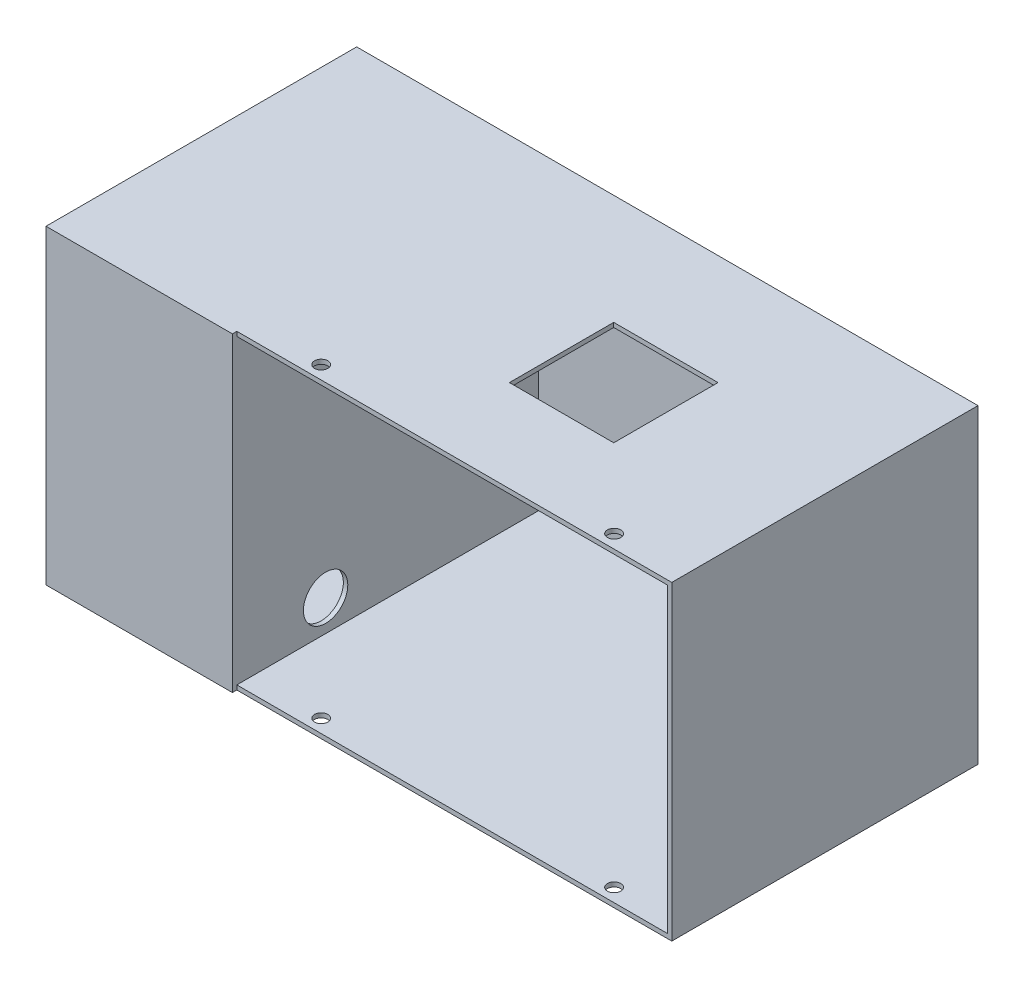
ISO-10303-21;
HEADER;
FILE_DESCRIPTION(('STEP AP214'),'2;1');
FILE_NAME('part.step','',(''),(''),'','','');
FILE_SCHEMA(('AUTOMOTIVE_DESIGN { 1 0 10303 214 1 1 1 1 }'));
ENDSEC;
DATA;
#1=APPLICATION_CONTEXT('core data for automotive mechanical design processes');
#2=APPLICATION_PROTOCOL_DEFINITION('international standard','automotive_design',2000,#1);
#3=PRODUCT_CONTEXT('',#1,'mechanical');
#4=PRODUCT('Part','Part','',(#3));
#5=PRODUCT_RELATED_PRODUCT_CATEGORY('part','',(#4));
#6=PRODUCT_DEFINITION_FORMATION('','',#4);
#7=PRODUCT_DEFINITION_CONTEXT('part definition',#1,'design');
#8=PRODUCT_DEFINITION('design','',#6,#7);
#9=PRODUCT_DEFINITION_SHAPE('','',#8);
#10=(LENGTH_UNIT() NAMED_UNIT(*) SI_UNIT(.MILLI.,.METRE.));
#11=(NAMED_UNIT(*) PLANE_ANGLE_UNIT() SI_UNIT($,.RADIAN.));
#12=(NAMED_UNIT(*) SI_UNIT($,.STERADIAN.) SOLID_ANGLE_UNIT());
#13=UNCERTAINTY_MEASURE_WITH_UNIT(LENGTH_MEASURE(1.E-05),#10,'distance_accuracy_value','');
#14=(GEOMETRIC_REPRESENTATION_CONTEXT(3) GLOBAL_UNCERTAINTY_ASSIGNED_CONTEXT((#13)) GLOBAL_UNIT_ASSIGNED_CONTEXT((#10,
#11,#12)) REPRESENTATION_CONTEXT('',''));
#15=CARTESIAN_POINT('',(0.,0.,0.));
#16=DIRECTION('',(0.,0.,1.));
#17=DIRECTION('',(1.,0.,0.));
#18=AXIS2_PLACEMENT_3D('',#15,#16,#17);
#19=CARTESIAN_POINT('',(0.,-29.6073277578654,70.));
#20=DIRECTION('',(0.,1.,0.));
#21=DIRECTION('',(0.,0.,1.));
#22=AXIS2_PLACEMENT_3D('',#19,#20,#21);
#23=PLANE('',#22);
#24=CARTESIAN_POINT('',(3.47062923138192,-29.6073277578654,66.));
#25=DIRECTION('',(0.,1.,0.));
#26=DIRECTION('',(0.,0.,1.));
#27=AXIS2_PLACEMENT_3D('',#24,#25,#26);
#28=CIRCLE('',#27,1.5);
#29=CARTESIAN_POINT('',(3.47062923138192,-29.6073277578654,67.5));
#30=VERTEX_POINT('',#29);
#31=EDGE_CURVE('E312',#30,#30,#28,.T.);
#32=ORIENTED_EDGE('',*,*,#31,.F.);
#33=EDGE_LOOP('',(#32));
#34=FACE_BOUND('',#33,.T.);
#35=CARTESIAN_POINT('',(69.4706292313819,-29.6073277578654,66.));
#36=DIRECTION('',(0.,1.,0.));
#37=DIRECTION('',(0.,0.,1.));
#38=AXIS2_PLACEMENT_3D('',#35,#36,#37);
#39=CIRCLE('',#38,1.5);
#40=CARTESIAN_POINT('',(69.4706292313819,-29.6073277578654,67.5));
#41=VERTEX_POINT('',#40);
#42=EDGE_CURVE('E302',#41,#41,#39,.T.);
#43=ORIENTED_EDGE('',*,*,#42,.F.);
#44=EDGE_LOOP('',(#43));
#45=FACE_BOUND('',#44,.T.);
#46=DIRECTION('',(0.,0.,-1.));
#47=VECTOR('',#46,1.);
#48=CARTESIAN_POINT('',(-12.5293707686181,-29.6073277578654,69.));
#49=LINE('',#48,#47);
#50=CARTESIAN_POINT('',(-12.5293707686181,-29.6073277578654,69.));
#51=VERTEX_POINT('',#50);
#52=CARTESIAN_POINT('',(-12.5293707686181,-29.6073277578654,1.));
#53=VERTEX_POINT('',#52);
#54=EDGE_CURVE('E393',#51,#53,#49,.T.);
#55=ORIENTED_EDGE('',*,*,#54,.F.);
#56=DIRECTION('',(1.,0.,0.));
#57=VECTOR('',#56,1.);
#58=CARTESIAN_POINT('',(0.,-29.6073277578654,69.));
#59=LINE('',#58,#57);
#60=CARTESIAN_POINT('',(84.4706292313819,-29.6073277578654,69.));
#61=VERTEX_POINT('',#60);
#62=EDGE_CURVE('E292',#51,#61,#59,.T.);
#63=ORIENTED_EDGE('',*,*,#62,.T.);
#64=DIRECTION('',(0.,0.,-1.));
#65=VECTOR('',#64,1.);
#66=CARTESIAN_POINT('',(84.4706292313819,-29.6073277578654,70.));
#67=LINE('',#66,#65);
#68=CARTESIAN_POINT('',(84.4706292313819,-29.6073277578654,1.));
#69=VERTEX_POINT('',#68);
#70=EDGE_CURVE('E410',#61,#69,#67,.T.);
#71=ORIENTED_EDGE('',*,*,#70,.T.);
#72=DIRECTION('',(1.,0.,0.));
#73=VECTOR('',#72,1.);
#74=CARTESIAN_POINT('',(0.,-29.6073277578654,1.));
#75=LINE('',#74,#73);
#76=EDGE_CURVE('E404',#53,#69,#75,.T.);
#77=ORIENTED_EDGE('',*,*,#76,.F.);
#78=EDGE_LOOP('',(#55,#63,#71,#77));
#79=FACE_BOUND('',#78,.T.);
#80=ADVANCED_FACE('F67',(#34,#45,#79),#23,.T.);
#81=CARTESIAN_POINT('',(0.,38.3926722421346,70.));
#82=DIRECTION('',(0.,1.,0.));
#83=DIRECTION('',(0.,0.,1.));
#84=AXIS2_PLACEMENT_3D('',#81,#82,#83);
#85=PLANE('',#84);
#86=DIRECTION('',(1.,0.,0.));
#87=VECTOR('',#86,1.);
#88=CARTESIAN_POINT('',(0.,38.3926722421346,24.7949933549175));
#89=LINE('',#88,#87);
#90=CARTESIAN_POINT('',(28.1884264574142,38.3926722421346,24.7949933549175));
#91=VERTEX_POINT('',#90);
#92=CARTESIAN_POINT('',(51.6884264574142,38.3926722421346,24.7949933549175));
#93=VERTEX_POINT('',#92);
#94=EDGE_CURVE('E261',#91,#93,#89,.T.);
#95=ORIENTED_EDGE('',*,*,#94,.F.);
#96=DIRECTION('',(0.,0.,1.));
#97=VECTOR('',#96,1.);
#98=CARTESIAN_POINT('',(28.1884264574142,38.3926722421346,70.));
#99=LINE('',#98,#97);
#100=CARTESIAN_POINT('',(28.1884264574142,38.3926722421346,48.2949933549175));
#101=VERTEX_POINT('',#100);
#102=EDGE_CURVE('E263',#91,#101,#99,.T.);
#103=ORIENTED_EDGE('',*,*,#102,.T.);
#104=DIRECTION('',(1.,0.,0.));
#105=VECTOR('',#104,1.);
#106=CARTESIAN_POINT('',(0.,38.3926722421346,48.2949933549175));
#107=LINE('',#106,#105);
#108=CARTESIAN_POINT('',(51.6884264574142,38.3926722421346,48.2949933549175));
#109=VERTEX_POINT('',#108);
#110=EDGE_CURVE('E256',#101,#109,#107,.T.);
#111=ORIENTED_EDGE('',*,*,#110,.T.);
#112=DIRECTION('',(0.,0.,1.));
#113=VECTOR('',#112,1.);
#114=CARTESIAN_POINT('',(51.6884264574142,38.3926722421346,70.));
#115=LINE('',#114,#113);
#116=EDGE_CURVE('E236',#93,#109,#115,.T.);
#117=ORIENTED_EDGE('',*,*,#116,.F.);
#118=EDGE_LOOP('',(#95,#103,#111,#117));
#119=FACE_BOUND('',#118,.T.);
#120=CARTESIAN_POINT('',(69.4706292313819,38.3926722421346,66.));
#121=DIRECTION('',(0.,1.,0.));
#122=DIRECTION('',(0.,0.,1.));
#123=AXIS2_PLACEMENT_3D('',#120,#121,#122);
#124=CIRCLE('',#123,1.5);
#125=CARTESIAN_POINT('',(69.4706292313819,38.3926722421346,67.5));
#126=VERTEX_POINT('',#125);
#127=EDGE_CURVE('E299',#126,#126,#124,.T.);
#128=ORIENTED_EDGE('',*,*,#127,.T.);
#129=EDGE_LOOP('',(#128));
#130=FACE_BOUND('',#129,.T.);
#131=CARTESIAN_POINT('',(3.47062923138192,38.3926722421346,66.));
#132=DIRECTION('',(0.,1.,0.));
#133=DIRECTION('',(0.,0.,1.));
#134=AXIS2_PLACEMENT_3D('',#131,#132,#133);
#135=CIRCLE('',#134,1.5);
#136=CARTESIAN_POINT('',(3.47062923138192,38.3926722421346,67.5));
#137=VERTEX_POINT('',#136);
#138=EDGE_CURVE('E309',#137,#137,#135,.T.);
#139=ORIENTED_EDGE('',*,*,#138,.T.);
#140=EDGE_LOOP('',(#139));
#141=FACE_BOUND('',#140,.T.);
#142=DIRECTION('',(1.,0.,0.));
#143=VECTOR('',#142,1.);
#144=CARTESIAN_POINT('',(0.,38.3926722421346,69.));
#145=LINE('',#144,#143);
#146=CARTESIAN_POINT('',(-12.5293707686181,38.3926722421346,69.));
#147=VERTEX_POINT('',#146);
#148=CARTESIAN_POINT('',(84.4706292313819,38.3926722421346,69.));
#149=VERTEX_POINT('',#148);
#150=EDGE_CURVE('E290',#147,#149,#145,.T.);
#151=ORIENTED_EDGE('',*,*,#150,.F.);
#152=DIRECTION('',(0.,0.,-1.));
#153=VECTOR('',#152,1.);
#154=CARTESIAN_POINT('',(-12.5293707686181,38.3926722421346,69.));
#155=LINE('',#154,#153);
#156=CARTESIAN_POINT('',(-12.5293707686181,38.3926722421346,1.));
#157=VERTEX_POINT('',#156);
#158=EDGE_CURVE('E391',#147,#157,#155,.T.);
#159=ORIENTED_EDGE('',*,*,#158,.T.);
#160=DIRECTION('',(1.,0.,0.));
#161=VECTOR('',#160,1.);
#162=CARTESIAN_POINT('',(0.,38.3926722421346,1.));
#163=LINE('',#162,#161);
#164=CARTESIAN_POINT('',(84.4706292313819,38.3926722421346,1.));
#165=VERTEX_POINT('',#164);
#166=EDGE_CURVE('E398',#157,#165,#163,.T.);
#167=ORIENTED_EDGE('',*,*,#166,.T.);
#168=DIRECTION('',(0.,0.,-1.));
#169=VECTOR('',#168,1.);
#170=CARTESIAN_POINT('',(84.4706292313819,38.3926722421346,70.));
#171=LINE('',#170,#169);
#172=EDGE_CURVE('E408',#149,#165,#171,.T.);
#173=ORIENTED_EDGE('',*,*,#172,.F.);
#174=EDGE_LOOP('',(#151,#159,#167,#173));
#175=FACE_BOUND('',#174,.T.);
#176=ADVANCED_FACE('F466',(#119,#130,#141,#175),#85,.F.);
#177=CARTESIAN_POINT('',(85.4706292313819,39.3926722421346,70.));
#178=DIRECTION('',(1.,0.,0.));
#179=DIRECTION('',(0.,0.,-1.));
#180=AXIS2_PLACEMENT_3D('',#177,#178,#179);
#181=PLANE('',#180);
#182=DIRECTION('',(0.,0.,-1.));
#183=VECTOR('',#182,1.);
#184=CARTESIAN_POINT('',(85.4706292313819,39.3926722421346,70.));
#185=LINE('',#184,#183);
#186=CARTESIAN_POINT('',(85.4706292313819,39.3926722421346,69.));
#187=VERTEX_POINT('',#186);
#188=CARTESIAN_POINT('',(85.4706292313819,39.3926722421346,0.));
#189=VERTEX_POINT('',#188);
#190=EDGE_CURVE('E436',#187,#189,#185,.T.);
#191=ORIENTED_EDGE('',*,*,#190,.F.);
#192=DIRECTION('',(0.,1.,0.));
#193=VECTOR('',#192,1.);
#194=CARTESIAN_POINT('',(85.4706292313819,39.3926722421346,69.));
#195=LINE('',#194,#193);
#196=CARTESIAN_POINT('',(85.4706292313819,-30.6073277578654,69.));
#197=VERTEX_POINT('',#196);
#198=EDGE_CURVE('E277',#197,#187,#195,.T.);
#199=ORIENTED_EDGE('',*,*,#198,.F.);
#200=DIRECTION('',(0.,0.,-1.));
#201=VECTOR('',#200,1.);
#202=CARTESIAN_POINT('',(85.4706292313819,-30.6073277578654,70.));
#203=LINE('',#202,#201);
#204=CARTESIAN_POINT('',(85.4706292313819,-30.6073277578654,0.));
#205=VERTEX_POINT('',#204);
#206=EDGE_CURVE('E438',#197,#205,#203,.T.);
#207=ORIENTED_EDGE('',*,*,#206,.T.);
#208=DIRECTION('',(0.,-1.,0.));
#209=VECTOR('',#208,1.);
#210=CARTESIAN_POINT('',(85.4706292313819,39.3926722421346,0.));
#211=LINE('',#210,#209);
#212=EDGE_CURVE('E425',#189,#205,#211,.T.);
#213=ORIENTED_EDGE('',*,*,#212,.F.);
#214=EDGE_LOOP('',(#191,#199,#207,#213));
#215=FACE_BOUND('',#214,.T.);
#216=ADVANCED_FACE('F469',(#215),#181,.T.);
#217=CARTESIAN_POINT('',(84.4706292313819,0.,70.));
#218=DIRECTION('',(1.,0.,0.));
#219=DIRECTION('',(0.,0.,-1.));
#220=AXIS2_PLACEMENT_3D('',#217,#218,#219);
#221=PLANE('',#220);
#222=DIRECTION('',(0.,-1.,0.));
#223=VECTOR('',#222,1.);
#224=CARTESIAN_POINT('',(84.4706292313819,0.,69.));
#225=LINE('',#224,#223);
#226=EDGE_CURVE('E286',#149,#61,#225,.T.);
#227=ORIENTED_EDGE('',*,*,#226,.F.);
#228=ORIENTED_EDGE('',*,*,#172,.T.);
#229=DIRECTION('',(0.,-1.,0.));
#230=VECTOR('',#229,1.);
#231=CARTESIAN_POINT('',(84.4706292313819,0.,1.));
#232=LINE('',#231,#230);
#233=EDGE_CURVE('E401',#165,#69,#232,.T.);
#234=ORIENTED_EDGE('',*,*,#233,.T.);
#235=ORIENTED_EDGE('',*,*,#70,.F.);
#236=EDGE_LOOP('',(#227,#228,#234,#235));
#237=FACE_BOUND('',#236,.T.);
#238=ADVANCED_FACE('F494',(#237),#221,.F.);
#239=CARTESIAN_POINT('',(0.,0.,1.));
#240=DIRECTION('',(0.,0.,1.));
#241=DIRECTION('',(1.,0.,0.));
#242=AXIS2_PLACEMENT_3D('',#239,#240,#241);
#243=PLANE('',#242);
#244=DIRECTION('',(0.,-1.,0.));
#245=VECTOR('',#244,1.);
#246=CARTESIAN_POINT('',(-13.5293707686181,38.3926722421346,1.));
#247=LINE('',#246,#245);
#248=CARTESIAN_POINT('',(-13.5293707686181,-14.6073277578654,1.));
#249=VERTEX_POINT('',#248);
#250=CARTESIAN_POINT('',(-13.5293707686181,-29.6073277578654,1.));
#251=VERTEX_POINT('',#250);
#252=EDGE_CURVE('E377',#249,#251,#247,.T.);
#253=ORIENTED_EDGE('',*,*,#252,.F.);
#254=DIRECTION('',(1.,0.,0.));
#255=VECTOR('',#254,1.);
#256=CARTESIAN_POINT('',(-55.0293707686181,-14.6073277578654,0.999999999999999));
#257=LINE('',#256,#255);
#258=CARTESIAN_POINT('',(-54.5293707686181,-14.6073277578654,1.00000000000001));
#259=VERTEX_POINT('',#258);
#260=EDGE_CURVE('E340',#259,#249,#257,.T.);
#261=ORIENTED_EDGE('',*,*,#260,.F.);
#262=DIRECTION('',(0.,-1.,0.));
#263=VECTOR('',#262,1.);
#264=CARTESIAN_POINT('',(-54.5293707686181,38.3926722421346,1.));
#265=LINE('',#264,#263);
#266=CARTESIAN_POINT('',(-54.5293707686181,-29.6073277578654,1.00000000000001));
#267=VERTEX_POINT('',#266);
#268=EDGE_CURVE('E358',#259,#267,#265,.T.);
#269=ORIENTED_EDGE('',*,*,#268,.T.);
#270=EDGE_CURVE('E405',#267,#251,#75,.T.);
#271=ORIENTED_EDGE('',*,*,#270,.T.);
#272=EDGE_LOOP('',(#253,#261,#269,#271));
#273=FACE_BOUND('',#272,.T.);
#274=ADVANCED_FACE('F533',(#273),#243,.T.);
#275=CARTESIAN_POINT('',(-54.5293707686181,38.3926722421346,1.));
#276=VERTEX_POINT('',#275);
#277=CARTESIAN_POINT('',(-54.5293707686181,-13.6073277578654,1.00000000000001));
#278=VERTEX_POINT('',#277);
#279=EDGE_CURVE('E359',#276,#278,#265,.T.);
#280=ORIENTED_EDGE('',*,*,#279,.T.);
#281=DIRECTION('',(1.,0.,0.));
#282=VECTOR('',#281,1.);
#283=CARTESIAN_POINT('',(-55.0293707686181,-13.6073277578654,0.999999999999999));
#284=LINE('',#283,#282);
#285=CARTESIAN_POINT('',(-13.5293707686181,-13.6073277578654,1.));
#286=VERTEX_POINT('',#285);
#287=EDGE_CURVE('E326',#278,#286,#284,.T.);
#288=ORIENTED_EDGE('',*,*,#287,.T.);
#289=CARTESIAN_POINT('',(-13.5293707686181,38.3926722421346,1.));
#290=VERTEX_POINT('',#289);
#291=EDGE_CURVE('E383',#290,#286,#247,.T.);
#292=ORIENTED_EDGE('',*,*,#291,.F.);
#293=EDGE_CURVE('E399',#276,#290,#163,.T.);
#294=ORIENTED_EDGE('',*,*,#293,.F.);
#295=EDGE_LOOP('',(#280,#288,#292,#294));
#296=FACE_BOUND('',#295,.T.);
#297=ADVANCED_FACE('F557',(#296),#243,.T.);
#298=CARTESIAN_POINT('',(-13.5293707686181,38.3926722421346,69.));
#299=DIRECTION('',(1.,0.,0.));
#300=DIRECTION('',(0.,1.,0.));
#301=AXIS2_PLACEMENT_3D('',#298,#299,#300);
#302=PLANE('',#301);
#303=CARTESIAN_POINT('',(-13.5293707686181,-22.6073277578654,49.));
#304=DIRECTION('',(-1.,0.,0.));
#305=DIRECTION('',(0.,-1.,0.));
#306=AXIS2_PLACEMENT_3D('',#303,#304,#305);
#307=CIRCLE('',#306,5.);
#308=CARTESIAN_POINT('',(-13.5293707686181,-27.6073277578654,49.));
#309=VERTEX_POINT('',#308);
#310=EDGE_CURVE('E613',#309,#309,#307,.T.);
#311=ORIENTED_EDGE('',*,*,#310,.F.);
#312=EDGE_LOOP('',(#311));
#313=FACE_BOUND('',#312,.T.);
#314=DIRECTION('',(0.,0.,1.));
#315=VECTOR('',#314,1.);
#316=CARTESIAN_POINT('',(-13.5293707686181,-14.6073277578654,0.999999999999999));
#317=LINE('',#316,#315);
#318=CARTESIAN_POINT('',(-13.5293707686181,-14.6073277578654,69.));
#319=VERTEX_POINT('',#318);
#320=EDGE_CURVE('E315',#249,#319,#317,.T.);
#321=ORIENTED_EDGE('',*,*,#320,.F.);
#322=ORIENTED_EDGE('',*,*,#252,.T.);
#323=DIRECTION('',(0.,0.,-1.));
#324=VECTOR('',#323,1.);
#325=CARTESIAN_POINT('',(-13.5293707686181,-29.6073277578654,69.));
#326=LINE('',#325,#324);
#327=CARTESIAN_POINT('',(-13.5293707686181,-29.6073277578654,69.));
#328=VERTEX_POINT('',#327);
#329=EDGE_CURVE('E395',#328,#251,#326,.T.);
#330=ORIENTED_EDGE('',*,*,#329,.F.);
#331=DIRECTION('',(0.,-1.,0.));
#332=VECTOR('',#331,1.);
#333=CARTESIAN_POINT('',(-13.5293707686181,38.3926722421346,69.));
#334=LINE('',#333,#332);
#335=EDGE_CURVE('E382',#319,#328,#334,.T.);
#336=ORIENTED_EDGE('',*,*,#335,.F.);
#337=EDGE_LOOP('',(#321,#322,#330,#336));
#338=FACE_BOUND('',#337,.T.);
#339=ADVANCED_FACE('F529',(#313,#338),#302,.F.);
#340=CARTESIAN_POINT('',(-13.5293707686181,14.3926722421346,35.));
#341=DIRECTION('',(1.,0.,0.));
#342=DIRECTION('',(0.,1.,0.));
#343=AXIS2_PLACEMENT_3D('',#340,#341,#342);
#344=CIRCLE('',#343,5.);
#345=CARTESIAN_POINT('',(-13.5293707686181,19.3926722421346,35.));
#346=VERTEX_POINT('',#345);
#347=EDGE_CURVE('E440',#346,#346,#344,.F.);
#348=ORIENTED_EDGE('',*,*,#347,.F.);
#349=EDGE_LOOP('',(#348));
#350=FACE_BOUND('',#349,.T.);
#351=DIRECTION('',(0.,0.,-1.));
#352=VECTOR('',#351,1.);
#353=CARTESIAN_POINT('',(-13.5293707686181,-13.6073277578654,0.999999999999999));
#354=LINE('',#353,#352);
#355=CARTESIAN_POINT('',(-13.5293707686181,-13.6073277578654,69.));
#356=VERTEX_POINT('',#355);
#357=EDGE_CURVE('E320',#356,#286,#354,.T.);
#358=ORIENTED_EDGE('',*,*,#357,.F.);
#359=CARTESIAN_POINT('',(-13.5293707686181,38.3926722421346,69.));
#360=VERTEX_POINT('',#359);
#361=EDGE_CURVE('E379',#360,#356,#334,.T.);
#362=ORIENTED_EDGE('',*,*,#361,.F.);
#363=DIRECTION('',(0.,0.,-1.));
#364=VECTOR('',#363,1.);
#365=CARTESIAN_POINT('',(-13.5293707686181,38.3926722421346,69.));
#366=LINE('',#365,#364);
#367=EDGE_CURVE('E381',#360,#290,#366,.T.);
#368=ORIENTED_EDGE('',*,*,#367,.T.);
#369=ORIENTED_EDGE('',*,*,#291,.T.);
#370=EDGE_LOOP('',(#358,#362,#368,#369));
#371=FACE_BOUND('',#370,.T.);
#372=ADVANCED_FACE('F564',(#350,#371),#302,.F.);
#373=CARTESIAN_POINT('',(-29.5293707686181,38.3926722421346,69.));
#374=DIRECTION('',(0.,0.,1.));
#375=DIRECTION('',(0.,-1.,0.));
#376=AXIS2_PLACEMENT_3D('',#373,#374,#375);
#377=PLANE('',#376);
#378=DIRECTION('',(-1.,0.,0.));
#379=VECTOR('',#378,1.);
#380=CARTESIAN_POINT('',(-29.5293707686181,-14.6073277578654,69.));
#381=LINE('',#380,#379);
#382=CARTESIAN_POINT('',(-54.5293707686181,-14.6073277578654,69.));
#383=VERTEX_POINT('',#382);
#384=EDGE_CURVE('E12',#319,#383,#381,.T.);
#385=ORIENTED_EDGE('',*,*,#384,.F.);
#386=ORIENTED_EDGE('',*,*,#335,.T.);
#387=DIRECTION('',(-1.,0.,0.));
#388=VECTOR('',#387,1.);
#389=CARTESIAN_POINT('',(-29.5293707686181,-29.6073277578654,69.));
#390=LINE('',#389,#388);
#391=CARTESIAN_POINT('',(-54.5293707686181,-29.6073277578654,69.));
#392=VERTEX_POINT('',#391);
#393=EDGE_CURVE('E373',#328,#392,#390,.T.);
#394=ORIENTED_EDGE('',*,*,#393,.T.);
#395=DIRECTION('',(0.,1.,0.));
#396=VECTOR('',#395,1.);
#397=CARTESIAN_POINT('',(-54.5293707686181,38.3926722421346,69.));
#398=LINE('',#397,#396);
#399=EDGE_CURVE('E366',#392,#383,#398,.T.);
#400=ORIENTED_EDGE('',*,*,#399,.T.);
#401=EDGE_LOOP('',(#385,#386,#394,#400));
#402=FACE_BOUND('',#401,.T.);
#403=ADVANCED_FACE('F518',(#402),#377,.F.);
#404=DIRECTION('',(1.,0.,0.));
#405=VECTOR('',#404,1.);
#406=CARTESIAN_POINT('',(-29.5293707686181,-13.6073277578654,69.));
#407=LINE('',#406,#405);
#408=CARTESIAN_POINT('',(-54.5293707686181,-13.6073277578654,69.));
#409=VERTEX_POINT('',#408);
#410=EDGE_CURVE('E76',#409,#356,#407,.T.);
#411=ORIENTED_EDGE('',*,*,#410,.F.);
#412=CARTESIAN_POINT('',(-54.5293707686181,38.3926722421346,69.));
#413=VERTEX_POINT('',#412);
#414=EDGE_CURVE('E365',#409,#413,#398,.T.);
#415=ORIENTED_EDGE('',*,*,#414,.T.);
#416=DIRECTION('',(-1.,0.,0.));
#417=VECTOR('',#416,1.);
#418=CARTESIAN_POINT('',(-29.5293707686181,38.3926722421346,69.));
#419=LINE('',#418,#417);
#420=EDGE_CURVE('E374',#360,#413,#419,.T.);
#421=ORIENTED_EDGE('',*,*,#420,.F.);
#422=ORIENTED_EDGE('',*,*,#361,.T.);
#423=EDGE_LOOP('',(#411,#415,#421,#422));
#424=FACE_BOUND('',#423,.T.);
#425=ADVANCED_FACE('F510',(#424),#377,.F.);
#426=ORIENTED_EDGE('',*,*,#393,.F.);
#427=ORIENTED_EDGE('',*,*,#329,.T.);
#428=ORIENTED_EDGE('',*,*,#270,.F.);
#429=DIRECTION('',(0.,0.,1.));
#430=VECTOR('',#429,1.);
#431=CARTESIAN_POINT('',(-54.5293707686181,-29.6073277578654,1.00000000000001));
#432=LINE('',#431,#430);
#433=EDGE_CURVE('E362',#267,#392,#432,.T.);
#434=ORIENTED_EDGE('',*,*,#433,.T.);
#435=EDGE_LOOP('',(#426,#427,#428,#434));
#436=FACE_BOUND('',#435,.T.);
#437=ADVANCED_FACE('F500',(#436),#23,.T.);
#438=ORIENTED_EDGE('',*,*,#367,.F.);
#439=ORIENTED_EDGE('',*,*,#420,.T.);
#440=DIRECTION('',(0.,0.,-1.));
#441=VECTOR('',#440,1.);
#442=CARTESIAN_POINT('',(-54.5293707686181,38.3926722421346,1.));
#443=LINE('',#442,#441);
#444=EDGE_CURVE('E369',#413,#276,#443,.T.);
#445=ORIENTED_EDGE('',*,*,#444,.T.);
#446=ORIENTED_EDGE('',*,*,#293,.T.);
#447=EDGE_LOOP('',(#438,#439,#445,#446));
#448=FACE_BOUND('',#447,.T.);
#449=ADVANCED_FACE('F472',(#448),#85,.F.);
#450=ORIENTED_EDGE('',*,*,#166,.F.);
#451=DIRECTION('',(0.,1.,0.));
#452=VECTOR('',#451,1.);
#453=CARTESIAN_POINT('',(-12.5293707686181,38.3926722421346,1.));
#454=LINE('',#453,#452);
#455=EDGE_CURVE('E386',#53,#157,#454,.T.);
#456=ORIENTED_EDGE('',*,*,#455,.F.);
#457=ORIENTED_EDGE('',*,*,#76,.T.);
#458=ORIENTED_EDGE('',*,*,#233,.F.);
#459=EDGE_LOOP('',(#450,#456,#457,#458));
#460=FACE_BOUND('',#459,.T.);
#461=ADVANCED_FACE('F491',(#460),#243,.T.);
#462=CARTESIAN_POINT('',(0.,0.,70.));
#463=DIRECTION('',(0.,0.,-1.));
#464=DIRECTION('',(-1.,0.,0.));
#465=AXIS2_PLACEMENT_3D('',#462,#463,#464);
#466=PLANE('',#465);
#467=DIRECTION('',(1.,0.,0.));
#468=VECTOR('',#467,1.);
#469=CARTESIAN_POINT('',(-54.5293707686181,-30.6073277578654,70.));
#470=LINE('',#469,#468);
#471=CARTESIAN_POINT('',(-54.5293707686181,-30.6073277578654,70.));
#472=VERTEX_POINT('',#471);
#473=CARTESIAN_POINT('',(-12.5293707686181,-30.6073277578654,70.));
#474=VERTEX_POINT('',#473);
#475=EDGE_CURVE('E413',#472,#474,#470,.T.);
#476=ORIENTED_EDGE('',*,*,#475,.T.);
#477=DIRECTION('',(0.,1.,0.));
#478=VECTOR('',#477,1.);
#479=CARTESIAN_POINT('',(-12.5293707686181,39.3926722421346,70.));
#480=LINE('',#479,#478);
#481=CARTESIAN_POINT('',(-12.5293707686181,39.3926722421346,70.));
#482=VERTEX_POINT('',#481);
#483=EDGE_CURVE('E356',#474,#482,#480,.T.);
#484=ORIENTED_EDGE('',*,*,#483,.T.);
#485=DIRECTION('',(1.,0.,0.));
#486=VECTOR('',#485,1.);
#487=CARTESIAN_POINT('',(-54.5293707686181,39.3926722421346,70.));
#488=LINE('',#487,#486);
#489=CARTESIAN_POINT('',(-54.5293707686181,39.3926722421346,70.));
#490=VERTEX_POINT('',#489);
#491=EDGE_CURVE('E416',#490,#482,#488,.T.);
#492=ORIENTED_EDGE('',*,*,#491,.F.);
#493=DIRECTION('',(0.,-1.,0.));
#494=VECTOR('',#493,1.);
#495=CARTESIAN_POINT('',(-54.5293707686181,39.3926722421346,70.));
#496=LINE('',#495,#494);
#497=EDGE_CURVE('E420',#490,#472,#496,.T.);
#498=ORIENTED_EDGE('',*,*,#497,.T.);
#499=EDGE_LOOP('',(#476,#484,#492,#498));
#500=FACE_BOUND('',#499,.T.);
#501=ADVANCED_FACE('F818',(#500),#466,.F.);
#502=CARTESIAN_POINT('',(0.,0.,0.));
#503=DIRECTION('',(0.,0.,-1.));
#504=DIRECTION('',(-1.,0.,0.));
#505=AXIS2_PLACEMENT_3D('',#502,#503,#504);
#506=PLANE('',#505);
#507=DIRECTION('',(1.,0.,0.));
#508=VECTOR('',#507,1.);
#509=CARTESIAN_POINT('',(-54.5293707686181,-30.6073277578654,0.));
#510=LINE('',#509,#508);
#511=CARTESIAN_POINT('',(-54.5293707686181,-30.6073277578654,0.));
#512=VERTEX_POINT('',#511);
#513=EDGE_CURVE('E412',#512,#205,#510,.T.);
#514=ORIENTED_EDGE('',*,*,#513,.F.);
#515=DIRECTION('',(0.,-1.,0.));
#516=VECTOR('',#515,1.);
#517=CARTESIAN_POINT('',(-54.5293707686181,39.3926722421346,0.));
#518=LINE('',#517,#516);
#519=CARTESIAN_POINT('',(-54.5293707686181,39.3926722421346,0.));
#520=VERTEX_POINT('',#519);
#521=EDGE_CURVE('E417',#520,#512,#518,.T.);
#522=ORIENTED_EDGE('',*,*,#521,.F.);
#523=DIRECTION('',(1.,0.,0.));
#524=VECTOR('',#523,1.);
#525=CARTESIAN_POINT('',(-54.5293707686181,39.3926722421346,0.));
#526=LINE('',#525,#524);
#527=EDGE_CURVE('E428',#520,#189,#526,.T.);
#528=ORIENTED_EDGE('',*,*,#527,.T.);
#529=ORIENTED_EDGE('',*,*,#212,.T.);
#530=EDGE_LOOP('',(#514,#522,#528,#529));
#531=FACE_BOUND('',#530,.T.);
#532=ADVANCED_FACE('F875',(#531),#506,.T.);
#533=CARTESIAN_POINT('',(-54.5293707686181,-30.6073277578654,70.));
#534=DIRECTION('',(0.,1.,0.));
#535=DIRECTION('',(0.,0.,1.));
#536=AXIS2_PLACEMENT_3D('',#533,#534,#535);
#537=PLANE('',#536);
#538=CARTESIAN_POINT('',(3.47062923138192,-30.6073277578654,66.));
#539=DIRECTION('',(0.,1.,0.));
#540=DIRECTION('',(0.,0.,1.));
#541=AXIS2_PLACEMENT_3D('',#538,#539,#540);
#542=CIRCLE('',#541,1.5);
#543=CARTESIAN_POINT('',(3.47062923138192,-30.6073277578654,67.5));
#544=VERTEX_POINT('',#543);
#545=EDGE_CURVE('E306',#544,#544,#542,.T.);
#546=ORIENTED_EDGE('',*,*,#545,.T.);
#547=EDGE_LOOP('',(#546));
#548=FACE_BOUND('',#547,.T.);
#549=CARTESIAN_POINT('',(69.4706292313819,-30.6073277578654,66.));
#550=DIRECTION('',(0.,1.,0.));
#551=DIRECTION('',(0.,0.,1.));
#552=AXIS2_PLACEMENT_3D('',#549,#550,#551);
#553=CIRCLE('',#552,1.5);
#554=CARTESIAN_POINT('',(69.4706292313819,-30.6073277578654,67.5));
#555=VERTEX_POINT('',#554);
#556=EDGE_CURVE('E296',#555,#555,#553,.T.);
#557=ORIENTED_EDGE('',*,*,#556,.T.);
#558=EDGE_LOOP('',(#557));
#559=FACE_BOUND('',#558,.T.);
#560=DIRECTION('',(1.,0.,0.));
#561=VECTOR('',#560,1.);
#562=CARTESIAN_POINT('',(-12.5293707686181,-30.6073277578654,69.));
#563=LINE('',#562,#561);
#564=CARTESIAN_POINT('',(-12.5293707686181,-30.6073277578654,69.));
#565=VERTEX_POINT('',#564);
#566=EDGE_CURVE('E275',#565,#197,#563,.T.);
#567=ORIENTED_EDGE('',*,*,#566,.F.);
#568=DIRECTION('',(0.,0.,1.));
#569=VECTOR('',#568,1.);
#570=CARTESIAN_POINT('',(-12.5293707686181,-30.6073277578654,69.));
#571=LINE('',#570,#569);
#572=EDGE_CURVE('E282',#565,#474,#571,.T.);
#573=ORIENTED_EDGE('',*,*,#572,.T.);
#574=ORIENTED_EDGE('',*,*,#475,.F.);
#575=DIRECTION('',(0.,0.,-1.));
#576=VECTOR('',#575,1.);
#577=CARTESIAN_POINT('',(-54.5293707686181,-30.6073277578654,70.));
#578=LINE('',#577,#576);
#579=EDGE_CURVE('E422',#472,#512,#578,.T.);
#580=ORIENTED_EDGE('',*,*,#579,.T.);
#581=ORIENTED_EDGE('',*,*,#513,.T.);
#582=ORIENTED_EDGE('',*,*,#206,.F.);
#583=EDGE_LOOP('',(#567,#573,#574,#580,#581,#582));
#584=FACE_BOUND('',#583,.T.);
#585=ADVANCED_FACE('F69',(#548,#559,#584),#537,.F.);
#586=CARTESIAN_POINT('',(-54.5293707686181,39.3926722421346,70.));
#587=DIRECTION('',(0.,1.,0.));
#588=DIRECTION('',(0.,0.,1.));
#589=AXIS2_PLACEMENT_3D('',#586,#587,#588);
#590=PLANE('',#589);
#591=DIRECTION('',(0.,0.,1.));
#592=VECTOR('',#591,1.);
#593=CARTESIAN_POINT('',(28.1884264574142,39.3926722421346,24.7949933549175));
#594=LINE('',#593,#592);
#595=CARTESIAN_POINT('',(28.1884264574142,39.3926722421346,24.7949933549175));
#596=VERTEX_POINT('',#595);
#597=CARTESIAN_POINT('',(28.1884264574142,39.3926722421346,48.2949933549175));
#598=VERTEX_POINT('',#597);
#599=EDGE_CURVE('E92',#596,#598,#594,.T.);
#600=ORIENTED_EDGE('',*,*,#599,.F.);
#601=DIRECTION('',(1.,0.,0.));
#602=VECTOR('',#601,1.);
#603=CARTESIAN_POINT('',(28.1884264574142,39.3926722421346,24.7949933549175));
#604=LINE('',#603,#602);
#605=CARTESIAN_POINT('',(51.6884264574142,39.3926722421346,24.7949933549175));
#606=VERTEX_POINT('',#605);
#607=EDGE_CURVE('E249',#596,#606,#604,.T.);
#608=ORIENTED_EDGE('',*,*,#607,.T.);
#609=DIRECTION('',(0.,0.,1.));
#610=VECTOR('',#609,1.);
#611=CARTESIAN_POINT('',(51.6884264574142,39.3926722421346,24.7949933549175));
#612=LINE('',#611,#610);
#613=CARTESIAN_POINT('',(51.6884264574142,39.3926722421346,48.2949933549175));
#614=VERTEX_POINT('',#613);
#615=EDGE_CURVE('E233',#606,#614,#612,.T.);
#616=ORIENTED_EDGE('',*,*,#615,.T.);
#617=DIRECTION('',(1.,0.,0.));
#618=VECTOR('',#617,1.);
#619=CARTESIAN_POINT('',(28.1884264574142,39.3926722421346,48.2949933549175));
#620=LINE('',#619,#618);
#621=EDGE_CURVE('E242',#598,#614,#620,.T.);
#622=ORIENTED_EDGE('',*,*,#621,.F.);
#623=EDGE_LOOP('',(#600,#608,#616,#622));
#624=FACE_BOUND('',#623,.T.);
#625=DIRECTION('',(0.,0.,1.));
#626=VECTOR('',#625,1.);
#627=CARTESIAN_POINT('',(-12.5293707686181,39.3926722421346,69.));
#628=LINE('',#627,#626);
#629=CARTESIAN_POINT('',(-12.5293707686181,39.3926722421346,69.));
#630=VERTEX_POINT('',#629);
#631=EDGE_CURVE('E283',#630,#482,#628,.T.);
#632=ORIENTED_EDGE('',*,*,#631,.F.);
#633=DIRECTION('',(-1.,0.,0.));
#634=VECTOR('',#633,1.);
#635=CARTESIAN_POINT('',(-12.5293707686181,39.3926722421346,69.));
#636=LINE('',#635,#634);
#637=EDGE_CURVE('E279',#187,#630,#636,.T.);
#638=ORIENTED_EDGE('',*,*,#637,.F.);
#639=ORIENTED_EDGE('',*,*,#190,.T.);
#640=ORIENTED_EDGE('',*,*,#527,.F.);
#641=DIRECTION('',(0.,0.,-1.));
#642=VECTOR('',#641,1.);
#643=CARTESIAN_POINT('',(-54.5293707686181,39.3926722421346,70.));
#644=LINE('',#643,#642);
#645=EDGE_CURVE('E434',#490,#520,#644,.T.);
#646=ORIENTED_EDGE('',*,*,#645,.F.);
#647=ORIENTED_EDGE('',*,*,#491,.T.);
#648=EDGE_LOOP('',(#632,#638,#639,#640,#646,#647));
#649=FACE_BOUND('',#648,.T.);
#650=CARTESIAN_POINT('',(3.47062923138192,39.3926722421346,66.));
#651=DIRECTION('',(0.,1.,0.));
#652=DIRECTION('',(0.,0.,1.));
#653=AXIS2_PLACEMENT_3D('',#650,#651,#652);
#654=CIRCLE('',#653,1.5);
#655=CARTESIAN_POINT('',(3.47062923138192,39.3926722421346,67.5));
#656=VERTEX_POINT('',#655);
#657=EDGE_CURVE('E305',#656,#656,#654,.T.);
#658=ORIENTED_EDGE('',*,*,#657,.F.);
#659=EDGE_LOOP('',(#658));
#660=FACE_BOUND('',#659,.T.);
#661=CARTESIAN_POINT('',(69.4706292313819,39.3926722421346,66.));
#662=DIRECTION('',(0.,1.,0.));
#663=DIRECTION('',(0.,0.,1.));
#664=AXIS2_PLACEMENT_3D('',#661,#662,#663);
#665=CIRCLE('',#664,1.5);
#666=CARTESIAN_POINT('',(69.4706292313819,39.3926722421346,67.5));
#667=VERTEX_POINT('',#666);
#668=EDGE_CURVE('E295',#667,#667,#665,.T.);
#669=ORIENTED_EDGE('',*,*,#668,.F.);
#670=EDGE_LOOP('',(#669));
#671=FACE_BOUND('',#670,.T.);
#672=ADVANCED_FACE('F246',(#624,#649,#660,#671),#590,.T.);
#673=CARTESIAN_POINT('',(-54.5293707686181,39.3926722421346,70.));
#674=DIRECTION('',(1.,0.,0.));
#675=DIRECTION('',(0.,0.,-1.));
#676=AXIS2_PLACEMENT_3D('',#673,#674,#675);
#677=PLANE('',#676);
#678=ORIENTED_EDGE('',*,*,#399,.F.);
#679=ORIENTED_EDGE('',*,*,#433,.F.);
#680=ORIENTED_EDGE('',*,*,#268,.F.);
#681=DIRECTION('',(0.,-1.,0.));
#682=VECTOR('',#681,1.);
#683=CARTESIAN_POINT('',(-54.5293707686181,39.3926722421346,1.));
#684=LINE('',#683,#682);
#685=EDGE_CURVE('E344',#278,#259,#684,.T.);
#686=ORIENTED_EDGE('',*,*,#685,.F.);
#687=ORIENTED_EDGE('',*,*,#279,.F.);
#688=ORIENTED_EDGE('',*,*,#444,.F.);
#689=ORIENTED_EDGE('',*,*,#414,.F.);
#690=EDGE_CURVE('E370',#383,#409,#398,.T.);
#691=ORIENTED_EDGE('',*,*,#690,.F.);
#692=EDGE_LOOP('',(#678,#679,#680,#686,#687,#688,#689,#691));
#693=FACE_BOUND('',#692,.T.);
#694=ORIENTED_EDGE('',*,*,#521,.T.);
#695=ORIENTED_EDGE('',*,*,#579,.F.);
#696=ORIENTED_EDGE('',*,*,#497,.F.);
#697=ORIENTED_EDGE('',*,*,#645,.T.);
#698=EDGE_LOOP('',(#694,#695,#696,#697));
#699=FACE_BOUND('',#698,.T.);
#700=ADVANCED_FACE('F454',(#693,#699),#677,.F.);
#701=CARTESIAN_POINT('',(-12.5293707686181,38.3926722421346,69.));
#702=DIRECTION('',(-1.,0.,0.));
#703=DIRECTION('',(0.,-1.,0.));
#704=AXIS2_PLACEMENT_3D('',#701,#702,#703);
#705=PLANE('',#704);
#706=CARTESIAN_POINT('',(-12.5293707686181,-22.6073277578654,49.));
#707=DIRECTION('',(-1.,0.,0.));
#708=DIRECTION('',(0.,-1.,0.));
#709=AXIS2_PLACEMENT_3D('',#706,#707,#708);
#710=CIRCLE('',#709,5.);
#711=CARTESIAN_POINT('',(-12.5293707686181,-27.6073277578654,49.));
#712=VERTEX_POINT('',#711);
#713=EDGE_CURVE('E71',#712,#712,#710,.T.);
#714=ORIENTED_EDGE('',*,*,#713,.T.);
#715=EDGE_LOOP('',(#714));
#716=FACE_BOUND('',#715,.T.);
#717=ORIENTED_EDGE('',*,*,#483,.F.);
#718=ORIENTED_EDGE('',*,*,#572,.F.);
#719=DIRECTION('',(0.,-1.,0.));
#720=VECTOR('',#719,1.);
#721=CARTESIAN_POINT('',(-12.5293707686181,39.3926722421346,69.));
#722=LINE('',#721,#720);
#723=EDGE_CURVE('E272',#51,#565,#722,.T.);
#724=ORIENTED_EDGE('',*,*,#723,.F.);
#725=ORIENTED_EDGE('',*,*,#54,.T.);
#726=ORIENTED_EDGE('',*,*,#455,.T.);
#727=ORIENTED_EDGE('',*,*,#158,.F.);
#728=EDGE_CURVE('E273',#630,#147,#722,.T.);
#729=ORIENTED_EDGE('',*,*,#728,.F.);
#730=ORIENTED_EDGE('',*,*,#631,.T.);
#731=EDGE_LOOP('',(#717,#718,#724,#725,#726,#727,#729,#730));
#732=FACE_BOUND('',#731,.T.);
#733=ADVANCED_FACE('F482',(#716,#732),#705,.F.);
#734=CARTESIAN_POINT('',(-33.5293707686181,14.3926722421346,35.));
#735=DIRECTION('',(-1.,0.,0.));
#736=DIRECTION('',(0.,-1.,0.));
#737=AXIS2_PLACEMENT_3D('',#734,#735,#736);
#738=PLANE('',#737);
#739=CARTESIAN_POINT('',(-33.5293707686181,14.3926722421346,35.));
#740=DIRECTION('',(-1.,0.,0.));
#741=DIRECTION('',(0.,-1.,0.));
#742=AXIS2_PLACEMENT_3D('',#739,#740,#741);
#743=CIRCLE('',#742,5.);
#744=CARTESIAN_POINT('',(-33.5293707686181,9.39267224213462,35.));
#745=VERTEX_POINT('',#744);
#746=EDGE_CURVE('E351',#745,#745,#743,.T.);
#747=ORIENTED_EDGE('',*,*,#746,.T.);
#748=EDGE_LOOP('',(#747));
#749=FACE_BOUND('',#748,.T.);
#750=CARTESIAN_POINT('',(-33.5293707686181,14.3926722421346,35.));
#751=DIRECTION('',(-1.,0.,0.));
#752=DIRECTION('',(0.,-1.,0.));
#753=AXIS2_PLACEMENT_3D('',#750,#751,#752);
#754=CIRCLE('',#753,3.);
#755=CARTESIAN_POINT('',(-33.5293707686181,11.3926722421346,35.));
#756=VERTEX_POINT('',#755);
#757=EDGE_CURVE('E348',#756,#756,#754,.T.);
#758=ORIENTED_EDGE('',*,*,#757,.F.);
#759=EDGE_LOOP('',(#758));
#760=FACE_BOUND('',#759,.T.);
#761=ADVANCED_FACE('F596',(#749,#760),#738,.T.);
#762=CARTESIAN_POINT('',(-33.5293707686181,14.3926722421346,35.));
#763=DIRECTION('',(1.,0.,0.));
#764=DIRECTION('',(0.,1.,0.));
#765=AXIS2_PLACEMENT_3D('',#762,#763,#764);
#766=CYLINDRICAL_SURFACE('',#765,5.);
#767=ORIENTED_EDGE('',*,*,#746,.F.);
#768=EDGE_LOOP('',(#767));
#769=FACE_BOUND('',#768,.T.);
#770=ORIENTED_EDGE('',*,*,#347,.T.);
#771=EDGE_LOOP('',(#770));
#772=FACE_BOUND('',#771,.T.);
#773=ADVANCED_FACE('F588',(#769,#772),#766,.T.);
#774=CARTESIAN_POINT('',(-33.5293707686181,14.3926722421346,35.));
#775=DIRECTION('',(1.,0.,0.));
#776=DIRECTION('',(0.,1.,0.));
#777=AXIS2_PLACEMENT_3D('',#774,#775,#776);
#778=CYLINDRICAL_SURFACE('',#777,3.);
#779=ORIENTED_EDGE('',*,*,#757,.T.);
#780=EDGE_LOOP('',(#779));
#781=FACE_BOUND('',#780,.T.);
#782=CARTESIAN_POINT('',(-13.5293707686181,14.3926722421346,35.));
#783=DIRECTION('',(-1.,0.,0.));
#784=DIRECTION('',(0.,-1.,0.));
#785=AXIS2_PLACEMENT_3D('',#782,#783,#784);
#786=CIRCLE('',#785,3.);
#787=CARTESIAN_POINT('',(-13.5293707686181,11.3926722421346,35.));
#788=VERTEX_POINT('',#787);
#789=EDGE_CURVE('E347',#788,#788,#786,.T.);
#790=ORIENTED_EDGE('',*,*,#789,.F.);
#791=EDGE_LOOP('',(#790));
#792=FACE_BOUND('',#791,.T.);
#793=ADVANCED_FACE('F580',(#781,#792),#778,.F.);
#794=ORIENTED_EDGE('',*,*,#789,.T.);
#795=EDGE_LOOP('',(#794));
#796=FACE_BOUND('',#795,.T.);
#797=ADVANCED_FACE('F569',(#796),#302,.F.);
#798=CARTESIAN_POINT('',(-55.0293707686181,-13.6073277578654,0.999999999999999));
#799=DIRECTION('',(0.,0.,1.));
#800=DIRECTION('',(1.,0.,0.));
#801=AXIS2_PLACEMENT_3D('',#798,#799,#800);
#802=PLANE('',#801);
#803=CARTESIAN_POINT('',(-55.0293707686181,-13.6073277578654,0.999999999999999));
#804=VERTEX_POINT('',#803);
#805=EDGE_CURVE('E331',#804,#278,#284,.T.);
#806=ORIENTED_EDGE('',*,*,#805,.T.);
#807=ORIENTED_EDGE('',*,*,#685,.T.);
#808=CARTESIAN_POINT('',(-55.0293707686181,-14.6073277578654,0.999999999999999));
#809=VERTEX_POINT('',#808);
#810=EDGE_CURVE('E341',#809,#259,#257,.T.);
#811=ORIENTED_EDGE('',*,*,#810,.F.);
#812=DIRECTION('',(0.,-1.,0.));
#813=VECTOR('',#812,1.);
#814=CARTESIAN_POINT('',(-55.0293707686181,-13.6073277578654,0.999999999999999));
#815=LINE('',#814,#813);
#816=EDGE_CURVE('E316',#804,#809,#815,.T.);
#817=ORIENTED_EDGE('',*,*,#816,.F.);
#818=EDGE_LOOP('',(#806,#807,#811,#817));
#819=FACE_BOUND('',#818,.T.);
#820=ADVANCED_FACE('F552',(#819),#802,.F.);
#821=CARTESIAN_POINT('',(-55.0293707686181,-13.6073277578654,69.));
#822=DIRECTION('',(0.,0.,-1.));
#823=DIRECTION('',(-1.,0.,0.));
#824=AXIS2_PLACEMENT_3D('',#821,#822,#823);
#825=PLANE('',#824);
#826=DIRECTION('',(1.,0.,0.));
#827=VECTOR('',#826,1.);
#828=CARTESIAN_POINT('',(-55.0293707686181,-14.6073277578654,69.));
#829=LINE('',#828,#827);
#830=CARTESIAN_POINT('',(-55.0293707686181,-14.6073277578654,69.));
#831=VERTEX_POINT('',#830);
#832=EDGE_CURVE('E337',#831,#383,#829,.T.);
#833=ORIENTED_EDGE('',*,*,#832,.T.);
#834=ORIENTED_EDGE('',*,*,#690,.T.);
#835=DIRECTION('',(1.,0.,0.));
#836=VECTOR('',#835,1.);
#837=CARTESIAN_POINT('',(-55.0293707686181,-13.6073277578654,69.));
#838=LINE('',#837,#836);
#839=CARTESIAN_POINT('',(-55.0293707686181,-13.6073277578654,69.));
#840=VERTEX_POINT('',#839);
#841=EDGE_CURVE('E334',#840,#409,#838,.T.);
#842=ORIENTED_EDGE('',*,*,#841,.F.);
#843=DIRECTION('',(0.,1.,0.));
#844=VECTOR('',#843,1.);
#845=CARTESIAN_POINT('',(-55.0293707686181,-13.6073277578654,69.));
#846=LINE('',#845,#844);
#847=EDGE_CURVE('E322',#831,#840,#846,.T.);
#848=ORIENTED_EDGE('',*,*,#847,.F.);
#849=EDGE_LOOP('',(#833,#834,#842,#848));
#850=FACE_BOUND('',#849,.T.);
#851=ADVANCED_FACE('F544',(#850),#825,.F.);
#852=CARTESIAN_POINT('',(-55.0293707686181,-14.6073277578654,0.999999999999999));
#853=DIRECTION('',(0.,1.,0.));
#854=DIRECTION('',(-1.,0.,0.));
#855=AXIS2_PLACEMENT_3D('',#852,#853,#854);
#856=PLANE('',#855);
#857=CARTESIAN_POINT('',(-48.93885994562,-14.6073277578654,61.9227562244635));
#858=DIRECTION('',(0.,1.,0.));
#859=DIRECTION('',(-1.,0.,0.));
#860=AXIS2_PLACEMENT_3D('',#857,#858,#859);
#861=CIRCLE('',#860,1.5);
#862=CARTESIAN_POINT('',(-50.43885994562,-14.6073277578654,61.9227562244635));
#863=VERTEX_POINT('',#862);
#864=EDGE_CURVE('E269',#863,#863,#861,.T.);
#865=ORIENTED_EDGE('',*,*,#864,.T.);
#866=EDGE_LOOP('',(#865));
#867=FACE_BOUND('',#866,.T.);
#868=ORIENTED_EDGE('',*,*,#320,.T.);
#869=ORIENTED_EDGE('',*,*,#384,.T.);
#870=ORIENTED_EDGE('',*,*,#832,.F.);
#871=DIRECTION('',(0.,0.,1.));
#872=VECTOR('',#871,1.);
#873=CARTESIAN_POINT('',(-55.0293707686181,-14.6073277578654,0.999999999999999));
#874=LINE('',#873,#872);
#875=EDGE_CURVE('E319',#809,#831,#874,.T.);
#876=ORIENTED_EDGE('',*,*,#875,.F.);
#877=ORIENTED_EDGE('',*,*,#810,.T.);
#878=ORIENTED_EDGE('',*,*,#260,.T.);
#879=EDGE_LOOP('',(#868,#869,#870,#876,#877,#878));
#880=FACE_BOUND('',#879,.T.);
#881=ADVANCED_FACE('F541',(#867,#880),#856,.F.);
#882=CARTESIAN_POINT('',(-55.0293707686181,-13.6073277578654,0.999999999999999));
#883=DIRECTION('',(0.,-1.,0.));
#884=DIRECTION('',(1.,0.,0.));
#885=AXIS2_PLACEMENT_3D('',#882,#883,#884);
#886=PLANE('',#885);
#887=CARTESIAN_POINT('',(-48.93885994562,-13.6073277578654,61.9227562244635));
#888=DIRECTION('',(0.,1.,0.));
#889=DIRECTION('',(-1.,0.,0.));
#890=AXIS2_PLACEMENT_3D('',#887,#888,#889);
#891=CIRCLE('',#890,1.5);
#892=CARTESIAN_POINT('',(-50.43885994562,-13.6073277578654,61.9227562244635));
#893=VERTEX_POINT('',#892);
#894=EDGE_CURVE('E266',#893,#893,#891,.T.);
#895=ORIENTED_EDGE('',*,*,#894,.F.);
#896=EDGE_LOOP('',(#895));
#897=FACE_BOUND('',#896,.T.);
#898=ORIENTED_EDGE('',*,*,#357,.T.);
#899=ORIENTED_EDGE('',*,*,#287,.F.);
#900=ORIENTED_EDGE('',*,*,#805,.F.);
#901=DIRECTION('',(0.,0.,-1.));
#902=VECTOR('',#901,1.);
#903=CARTESIAN_POINT('',(-55.0293707686181,-13.6073277578654,0.999999999999999));
#904=LINE('',#903,#902);
#905=EDGE_CURVE('E324',#840,#804,#904,.T.);
#906=ORIENTED_EDGE('',*,*,#905,.F.);
#907=ORIENTED_EDGE('',*,*,#841,.T.);
#908=ORIENTED_EDGE('',*,*,#410,.T.);
#909=EDGE_LOOP('',(#898,#899,#900,#906,#907,#908));
#910=FACE_BOUND('',#909,.T.);
#911=ADVANCED_FACE('F560',(#897,#910),#886,.F.);
#912=CARTESIAN_POINT('',(-55.0293707686181,0.,0.));
#913=DIRECTION('',(-1.,0.,0.));
#914=DIRECTION('',(0.,0.,1.));
#915=AXIS2_PLACEMENT_3D('',#912,#913,#914);
#916=PLANE('',#915);
#917=ORIENTED_EDGE('',*,*,#816,.T.);
#918=ORIENTED_EDGE('',*,*,#875,.T.);
#919=ORIENTED_EDGE('',*,*,#847,.T.);
#920=ORIENTED_EDGE('',*,*,#905,.T.);
#921=EDGE_LOOP('',(#917,#918,#919,#920));
#922=FACE_BOUND('',#921,.T.);
#923=ADVANCED_FACE('F461',(#922),#916,.T.);
#924=CARTESIAN_POINT('',(69.4706292313819,138.392672242135,66.));
#925=DIRECTION('',(0.,-1.,0.));
#926=DIRECTION('',(0.,0.,-1.));
#927=AXIS2_PLACEMENT_3D('',#924,#925,#926);
#928=CYLINDRICAL_SURFACE('',#927,1.5);
#929=ORIENTED_EDGE('',*,*,#668,.T.);
#930=EDGE_LOOP('',(#929));
#931=FACE_BOUND('',#930,.T.);
#932=ORIENTED_EDGE('',*,*,#127,.F.);
#933=EDGE_LOOP('',(#932));
#934=FACE_BOUND('',#933,.T.);
#935=ADVANCED_FACE('F458',(#931,#934),#928,.F.);
#936=CARTESIAN_POINT('',(3.47062923138192,138.392672242135,66.));
#937=DIRECTION('',(0.,-1.,0.));
#938=DIRECTION('',(0.,0.,-1.));
#939=AXIS2_PLACEMENT_3D('',#936,#937,#938);
#940=CYLINDRICAL_SURFACE('',#939,1.5);
#941=ORIENTED_EDGE('',*,*,#657,.T.);
#942=EDGE_LOOP('',(#941));
#943=FACE_BOUND('',#942,.T.);
#944=ORIENTED_EDGE('',*,*,#138,.F.);
#945=EDGE_LOOP('',(#944));
#946=FACE_BOUND('',#945,.T.);
#947=ADVANCED_FACE('F449',(#943,#946),#940,.F.);
#948=ORIENTED_EDGE('',*,*,#42,.T.);
#949=EDGE_LOOP('',(#948));
#950=FACE_BOUND('',#949,.T.);
#951=ORIENTED_EDGE('',*,*,#556,.F.);
#952=EDGE_LOOP('',(#951));
#953=FACE_BOUND('',#952,.T.);
#954=ADVANCED_FACE('F463',(#950,#953),#928,.F.);
#955=ORIENTED_EDGE('',*,*,#31,.T.);
#956=EDGE_LOOP('',(#955));
#957=FACE_BOUND('',#956,.T.);
#958=ORIENTED_EDGE('',*,*,#545,.F.);
#959=EDGE_LOOP('',(#958));
#960=FACE_BOUND('',#959,.T.);
#961=ADVANCED_FACE('F640',(#957,#960),#940,.F.);
#962=CARTESIAN_POINT('',(0.,0.,69.));
#963=DIRECTION('',(0.,0.,1.));
#964=DIRECTION('',(1.,0.,0.));
#965=AXIS2_PLACEMENT_3D('',#962,#963,#964);
#966=PLANE('',#965);
#967=ORIENTED_EDGE('',*,*,#723,.T.);
#968=ORIENTED_EDGE('',*,*,#566,.T.);
#969=ORIENTED_EDGE('',*,*,#198,.T.);
#970=ORIENTED_EDGE('',*,*,#637,.T.);
#971=ORIENTED_EDGE('',*,*,#728,.T.);
#972=ORIENTED_EDGE('',*,*,#150,.T.);
#973=ORIENTED_EDGE('',*,*,#226,.T.);
#974=ORIENTED_EDGE('',*,*,#62,.F.);
#975=EDGE_LOOP('',(#967,#968,#969,#970,#971,#972,#973,#974));
#976=FACE_BOUND('',#975,.T.);
#977=ADVANCED_FACE('F495',(#976),#966,.T.);
#978=CARTESIAN_POINT('',(-48.93885994562,-15.1073277578654,61.9227562244635));
#979=DIRECTION('',(0.,1.,0.));
#980=DIRECTION('',(-1.,0.,0.));
#981=AXIS2_PLACEMENT_3D('',#978,#979,#980);
#982=CYLINDRICAL_SURFACE('',#981,1.5);
#983=ORIENTED_EDGE('',*,*,#894,.T.);
#984=EDGE_LOOP('',(#983));
#985=FACE_BOUND('',#984,.T.);
#986=ORIENTED_EDGE('',*,*,#864,.F.);
#987=EDGE_LOOP('',(#986));
#988=FACE_BOUND('',#987,.T.);
#989=ADVANCED_FACE('F634',(#985,#988),#982,.F.);
#990=CARTESIAN_POINT('',(28.1884264574142,10.8926722421346,24.7949933549175));
#991=DIRECTION('',(-1.,0.,0.));
#992=DIRECTION('',(0.,0.,1.));
#993=AXIS2_PLACEMENT_3D('',#990,#991,#992);
#994=PLANE('',#993);
#995=DIRECTION('',(0.,1.,0.));
#996=VECTOR('',#995,1.);
#997=CARTESIAN_POINT('',(28.1884264574142,10.8926722421346,24.7949933549175));
#998=LINE('',#997,#996);
#999=EDGE_CURVE('E254',#91,#596,#998,.T.);
#1000=ORIENTED_EDGE('',*,*,#999,.T.);
#1001=ORIENTED_EDGE('',*,*,#599,.T.);
#1002=DIRECTION('',(0.,1.,0.));
#1003=VECTOR('',#1002,1.);
#1004=CARTESIAN_POINT('',(28.1884264574142,10.8926722421346,48.2949933549175));
#1005=LINE('',#1004,#1003);
#1006=EDGE_CURVE('E239',#101,#598,#1005,.T.);
#1007=ORIENTED_EDGE('',*,*,#1006,.F.);
#1008=ORIENTED_EDGE('',*,*,#102,.F.);
#1009=EDGE_LOOP('',(#1000,#1001,#1007,#1008));
#1010=FACE_BOUND('',#1009,.T.);
#1011=ADVANCED_FACE('F628',(#1010),#994,.F.);
#1012=CARTESIAN_POINT('',(28.1884264574142,10.8926722421346,24.7949933549175));
#1013=DIRECTION('',(0.,0.,1.));
#1014=DIRECTION('',(1.,0.,0.));
#1015=AXIS2_PLACEMENT_3D('',#1012,#1013,#1014);
#1016=PLANE('',#1015);
#1017=ORIENTED_EDGE('',*,*,#94,.T.);
#1018=DIRECTION('',(0.,1.,0.));
#1019=VECTOR('',#1018,1.);
#1020=CARTESIAN_POINT('',(51.6884264574142,10.8926722421346,24.7949933549175));
#1021=LINE('',#1020,#1019);
#1022=EDGE_CURVE('E238',#93,#606,#1021,.T.);
#1023=ORIENTED_EDGE('',*,*,#1022,.T.);
#1024=ORIENTED_EDGE('',*,*,#607,.F.);
#1025=ORIENTED_EDGE('',*,*,#999,.F.);
#1026=EDGE_LOOP('',(#1017,#1023,#1024,#1025));
#1027=FACE_BOUND('',#1026,.T.);
#1028=ADVANCED_FACE('F625',(#1027),#1016,.T.);
#1029=CARTESIAN_POINT('',(51.6884264574142,10.8926722421346,24.7949933549175));
#1030=DIRECTION('',(-1.,0.,0.));
#1031=DIRECTION('',(0.,0.,1.));
#1032=AXIS2_PLACEMENT_3D('',#1029,#1030,#1031);
#1033=PLANE('',#1032);
#1034=ORIENTED_EDGE('',*,*,#116,.T.);
#1035=DIRECTION('',(0.,1.,0.));
#1036=VECTOR('',#1035,1.);
#1037=CARTESIAN_POINT('',(51.6884264574142,10.8926722421346,48.2949933549175));
#1038=LINE('',#1037,#1036);
#1039=EDGE_CURVE('E84',#109,#614,#1038,.T.);
#1040=ORIENTED_EDGE('',*,*,#1039,.T.);
#1041=ORIENTED_EDGE('',*,*,#615,.F.);
#1042=ORIENTED_EDGE('',*,*,#1022,.F.);
#1043=EDGE_LOOP('',(#1034,#1040,#1041,#1042));
#1044=FACE_BOUND('',#1043,.T.);
#1045=ADVANCED_FACE('F230',(#1044),#1033,.T.);
#1046=CARTESIAN_POINT('',(28.1884264574142,10.8926722421346,48.2949933549175));
#1047=DIRECTION('',(0.,0.,1.));
#1048=DIRECTION('',(1.,0.,0.));
#1049=AXIS2_PLACEMENT_3D('',#1046,#1047,#1048);
#1050=PLANE('',#1049);
#1051=ORIENTED_EDGE('',*,*,#1006,.T.);
#1052=ORIENTED_EDGE('',*,*,#621,.T.);
#1053=ORIENTED_EDGE('',*,*,#1039,.F.);
#1054=ORIENTED_EDGE('',*,*,#110,.F.);
#1055=EDGE_LOOP('',(#1051,#1052,#1053,#1054));
#1056=FACE_BOUND('',#1055,.T.);
#1057=ADVANCED_FACE('F243',(#1056),#1050,.F.);
#1058=CARTESIAN_POINT('',(2.97062923138193,-22.6073277578654,49.));
#1059=DIRECTION('',(-1.,0.,0.));
#1060=DIRECTION('',(0.,-1.,0.));
#1061=AXIS2_PLACEMENT_3D('',#1058,#1059,#1060);
#1062=CYLINDRICAL_SURFACE('',#1061,5.);
#1063=ORIENTED_EDGE('',*,*,#310,.T.);
#1064=EDGE_LOOP('',(#1063));
#1065=FACE_BOUND('',#1064,.T.);
#1066=ORIENTED_EDGE('',*,*,#713,.F.);
#1067=EDGE_LOOP('',(#1066));
#1068=FACE_BOUND('',#1067,.T.);
#1069=ADVANCED_FACE('F618',(#1065,#1068),#1062,.F.);
#1070=CLOSED_SHELL('',(#80,#176,#216,#238,#274,#297,#339,#372,#403,#425,#437,#449,#461,#501,
#532,#585,#672,#700,#733,#761,#773,#793,#797,#820,#851,#881,#911,#923,#935,#947,#954,#961,#977,
#989,#1011,#1028,#1045,#1057,#1069));
#1071=MANIFOLD_SOLID_BREP('B2',#1070);
#1072=ADVANCED_BREP_SHAPE_REPRESENTATION('',(#18,#1071),#14);
#1073=SHAPE_DEFINITION_REPRESENTATION(#9,#1072);
ENDSEC;
END-ISO-10303-21;
